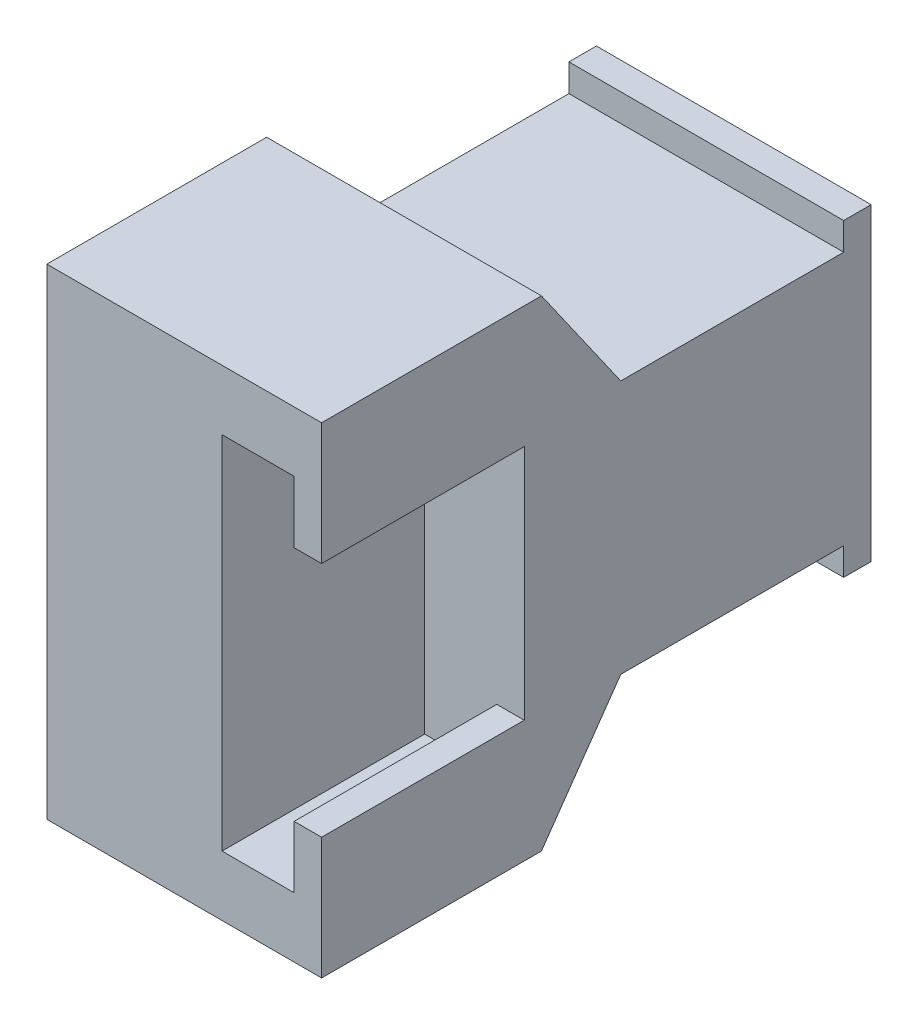
ISO-10303-21;
HEADER;
FILE_DESCRIPTION(('STEP AP214'),'2;1');
FILE_NAME('part.step','',(''),(''),'','','');
FILE_SCHEMA(('AUTOMOTIVE_DESIGN { 1 0 10303 214 1 1 1 1 }'));
ENDSEC;
DATA;
#1=APPLICATION_CONTEXT('core data for automotive mechanical design processes');
#2=APPLICATION_PROTOCOL_DEFINITION('international standard','automotive_design',2000,#1);
#3=PRODUCT_CONTEXT('',#1,'mechanical');
#4=PRODUCT('Part','Part','',(#3));
#5=PRODUCT_RELATED_PRODUCT_CATEGORY('part','',(#4));
#6=PRODUCT_DEFINITION_FORMATION('','',#4);
#7=PRODUCT_DEFINITION_CONTEXT('part definition',#1,'design');
#8=PRODUCT_DEFINITION('design','',#6,#7);
#9=PRODUCT_DEFINITION_SHAPE('','',#8);
#10=(LENGTH_UNIT() NAMED_UNIT(*) SI_UNIT(.MILLI.,.METRE.));
#11=(NAMED_UNIT(*) PLANE_ANGLE_UNIT() SI_UNIT($,.RADIAN.));
#12=(NAMED_UNIT(*) SI_UNIT($,.STERADIAN.) SOLID_ANGLE_UNIT());
#13=UNCERTAINTY_MEASURE_WITH_UNIT(LENGTH_MEASURE(1.E-05),#10,'distance_accuracy_value','');
#14=(GEOMETRIC_REPRESENTATION_CONTEXT(3) GLOBAL_UNCERTAINTY_ASSIGNED_CONTEXT((#13)) GLOBAL_UNIT_ASSIGNED_CONTEXT((#10,
#11,#12)) REPRESENTATION_CONTEXT('',''));
#15=CARTESIAN_POINT('',(0.,0.,0.));
#16=DIRECTION('',(0.,0.,1.));
#17=DIRECTION('',(1.,0.,0.));
#18=AXIS2_PLACEMENT_3D('',#15,#16,#17);
#19=CARTESIAN_POINT('',(8.00000000000001,13.125,25.25));
#20=DIRECTION('',(1.,0.,0.));
#21=DIRECTION('',(0.,1.,0.));
#22=AXIS2_PLACEMENT_3D('',#19,#20,#21);
#23=PLANE('',#22);
#24=DIRECTION('',(0.,0.,1.));
#25=VECTOR('',#24,1.);
#26=CARTESIAN_POINT('',(8.00000000000001,-8.625,25.25));
#27=LINE('',#26,#25);
#28=CARTESIAN_POINT('',(8.00000000000001,-8.625,25.25));
#29=VERTEX_POINT('',#28);
#30=CARTESIAN_POINT('',(8.00000000000001,-8.625,40.));
#31=VERTEX_POINT('',#30);
#32=EDGE_CURVE('E201',#29,#31,#27,.T.);
#33=ORIENTED_EDGE('',*,*,#32,.F.);
#34=DIRECTION('',(0.,1.,0.));
#35=VECTOR('',#34,1.);
#36=CARTESIAN_POINT('',(8.00000000000001,13.125,25.25));
#37=LINE('',#36,#35);
#38=CARTESIAN_POINT('',(8.00000000000001,-13.125,25.25));
#39=VERTEX_POINT('',#38);
#40=EDGE_CURVE('E207',#39,#29,#37,.T.);
#41=ORIENTED_EDGE('',*,*,#40,.F.);
#42=DIRECTION('',(0.,0.,1.));
#43=VECTOR('',#42,1.);
#44=CARTESIAN_POINT('',(8.00000000000001,-13.125,25.25));
#45=LINE('',#44,#43);
#46=CARTESIAN_POINT('',(8.00000000000001,-13.125,40.));
#47=VERTEX_POINT('',#46);
#48=EDGE_CURVE('E233',#39,#47,#45,.T.);
#49=ORIENTED_EDGE('',*,*,#48,.T.);
#50=DIRECTION('',(0.,1.,0.));
#51=VECTOR('',#50,1.);
#52=CARTESIAN_POINT('',(8.00000000000001,13.125,40.));
#53=LINE('',#52,#51);
#54=EDGE_CURVE('E216',#47,#31,#53,.T.);
#55=ORIENTED_EDGE('',*,*,#54,.T.);
#56=EDGE_LOOP('',(#33,#41,#49,#55));
#57=FACE_BOUND('',#56,.T.);
#58=ADVANCED_FACE('F41',(#57),#23,.F.);
#59=CARTESIAN_POINT('',(-10.,9.25,17.));
#60=DIRECTION('',(0.,-1.,0.));
#61=DIRECTION('',(0.,0.,-1.));
#62=AXIS2_PLACEMENT_3D('',#59,#60,#61);
#63=PLANE('',#62);
#64=DIRECTION('',(1.,0.,0.));
#65=VECTOR('',#64,1.);
#66=CARTESIAN_POINT('',(-10.,9.25,2.));
#67=LINE('',#66,#65);
#68=CARTESIAN_POINT('',(-10.,9.25,2.));
#69=VERTEX_POINT('',#68);
#70=CARTESIAN_POINT('',(10.,9.25,2.));
#71=VERTEX_POINT('',#70);
#72=EDGE_CURVE('E258',#69,#71,#67,.T.);
#73=ORIENTED_EDGE('',*,*,#72,.F.);
#74=DIRECTION('',(0.,0.,-1.));
#75=VECTOR('',#74,1.);
#76=CARTESIAN_POINT('',(-10.,9.25,17.));
#77=LINE('',#76,#75);
#78=CARTESIAN_POINT('',(-10.,9.25,18.225));
#79=VERTEX_POINT('',#78);
#80=EDGE_CURVE('E310',#79,#69,#77,.T.);
#81=ORIENTED_EDGE('',*,*,#80,.F.);
#82=DIRECTION('',(-1.,0.,0.));
#83=VECTOR('',#82,1.);
#84=CARTESIAN_POINT('',(-10.,9.25,18.225));
#85=LINE('',#84,#83);
#86=CARTESIAN_POINT('',(10.,9.25,18.225));
#87=VERTEX_POINT('',#86);
#88=EDGE_CURVE('E318',#79,#87,#85,.F.);
#89=ORIENTED_EDGE('',*,*,#88,.T.);
#90=DIRECTION('',(0.,0.,-1.));
#91=VECTOR('',#90,1.);
#92=CARTESIAN_POINT('',(10.,9.25,17.));
#93=LINE('',#92,#91);
#94=EDGE_CURVE('E309',#87,#71,#93,.T.);
#95=ORIENTED_EDGE('',*,*,#94,.T.);
#96=EDGE_LOOP('',(#73,#81,#89,#95));
#97=FACE_BOUND('',#96,.T.);
#98=ADVANCED_FACE('F357',(#97),#63,.F.);
#99=CARTESIAN_POINT('',(-10.,-9.25,17.));
#100=DIRECTION('',(0.,1.,0.));
#101=DIRECTION('',(0.,0.,1.));
#102=AXIS2_PLACEMENT_3D('',#99,#100,#101);
#103=PLANE('',#102);
#104=DIRECTION('',(-1.,0.,0.));
#105=VECTOR('',#104,1.);
#106=CARTESIAN_POINT('',(-10.,-9.25,2.));
#107=LINE('',#106,#105);
#108=CARTESIAN_POINT('',(10.,-9.25,2.00000000000001));
#109=VERTEX_POINT('',#108);
#110=CARTESIAN_POINT('',(-10.,-9.25,2.));
#111=VERTEX_POINT('',#110);
#112=EDGE_CURVE('E280',#109,#111,#107,.T.);
#113=ORIENTED_EDGE('',*,*,#112,.F.);
#114=DIRECTION('',(0.,0.,-1.));
#115=VECTOR('',#114,1.);
#116=CARTESIAN_POINT('',(10.,-9.25,17.));
#117=LINE('',#116,#115);
#118=CARTESIAN_POINT('',(10.,-9.25,18.225));
#119=VERTEX_POINT('',#118);
#120=EDGE_CURVE('E305',#119,#109,#117,.T.);
#121=ORIENTED_EDGE('',*,*,#120,.F.);
#122=DIRECTION('',(1.,0.,0.));
#123=VECTOR('',#122,1.);
#124=CARTESIAN_POINT('',(-10.,-9.25,18.225));
#125=LINE('',#124,#123);
#126=CARTESIAN_POINT('',(-10.,-9.25,18.225));
#127=VERTEX_POINT('',#126);
#128=EDGE_CURVE('E11',#119,#127,#125,.F.);
#129=ORIENTED_EDGE('',*,*,#128,.T.);
#130=DIRECTION('',(0.,0.,-1.));
#131=VECTOR('',#130,1.);
#132=CARTESIAN_POINT('',(-10.,-9.25,17.));
#133=LINE('',#132,#131);
#134=EDGE_CURVE('E304',#127,#111,#133,.T.);
#135=ORIENTED_EDGE('',*,*,#134,.T.);
#136=EDGE_LOOP('',(#113,#121,#129,#135));
#137=FACE_BOUND('',#136,.T.);
#138=ADVANCED_FACE('F378',(#137),#103,.F.);
#139=CARTESIAN_POINT('',(10.,9.25,17.));
#140=DIRECTION('',(-1.,0.,0.));
#141=DIRECTION('',(0.,0.,1.));
#142=AXIS2_PLACEMENT_3D('',#139,#140,#141);
#143=PLANE('',#142);
#144=DIRECTION('',(0.,1.,0.));
#145=VECTOR('',#144,1.);
#146=CARTESIAN_POINT('',(10.,8.625,25.25));
#147=LINE('',#146,#145);
#148=CARTESIAN_POINT('',(10.,-8.625,25.25));
#149=VERTEX_POINT('',#148);
#150=CARTESIAN_POINT('',(10.,8.625,25.25));
#151=VERTEX_POINT('',#150);
#152=EDGE_CURVE('E189',#149,#151,#147,.T.);
#153=ORIENTED_EDGE('',*,*,#152,.F.);
#154=DIRECTION('',(0.,0.,1.));
#155=VECTOR('',#154,1.);
#156=CARTESIAN_POINT('',(10.,-8.625,25.25));
#157=LINE('',#156,#155);
#158=CARTESIAN_POINT('',(10.,-8.625,40.));
#159=VERTEX_POINT('',#158);
#160=EDGE_CURVE('E341',#149,#159,#157,.T.);
#161=ORIENTED_EDGE('',*,*,#160,.T.);
#162=DIRECTION('',(0.,1.,0.));
#163=VECTOR('',#162,1.);
#164=CARTESIAN_POINT('',(10.,17.5,40.));
#165=LINE('',#164,#163);
#166=CARTESIAN_POINT('',(10.,-17.5,40.));
#167=VERTEX_POINT('',#166);
#168=EDGE_CURVE('E238',#167,#159,#165,.T.);
#169=ORIENTED_EDGE('',*,*,#168,.F.);
#170=DIRECTION('',(0.,0.,-1.));
#171=VECTOR('',#170,1.);
#172=CARTESIAN_POINT('',(10.,-17.5,40.));
#173=LINE('',#172,#171);
#174=CARTESIAN_POINT('',(10.,-17.5,24.0000000000001));
#175=VERTEX_POINT('',#174);
#176=EDGE_CURVE('E250',#167,#175,#173,.T.);
#177=ORIENTED_EDGE('',*,*,#176,.T.);
#178=DIRECTION('',(0.,-0.819231920519039,0.57346234436333));
#179=VECTOR('',#178,1.);
#180=CARTESIAN_POINT('',(10.,-17.5,24.0000000000001));
#181=LINE('',#180,#179);
#182=EDGE_CURVE('E327',#175,#119,#181,.F.);
#183=ORIENTED_EDGE('',*,*,#182,.T.);
#184=ORIENTED_EDGE('',*,*,#120,.T.);
#185=DIRECTION('',(0.,1.,0.));
#186=VECTOR('',#185,1.);
#187=CARTESIAN_POINT('',(10.,-11.25,2.00000000000001));
#188=LINE('',#187,#186);
#189=CARTESIAN_POINT('',(10.,-11.25,2.00000000000001));
#190=VERTEX_POINT('',#189);
#191=EDGE_CURVE('E294',#190,#109,#188,.T.);
#192=ORIENTED_EDGE('',*,*,#191,.F.);
#193=DIRECTION('',(0.,0.,1.));
#194=VECTOR('',#193,1.);
#195=CARTESIAN_POINT('',(10.,-11.25,2.00000000000001));
#196=LINE('',#195,#194);
#197=CARTESIAN_POINT('',(10.,-11.25,0.));
#198=VERTEX_POINT('',#197);
#199=EDGE_CURVE('E278',#198,#190,#196,.T.);
#200=ORIENTED_EDGE('',*,*,#199,.F.);
#201=DIRECTION('',(0.,1.,0.));
#202=VECTOR('',#201,1.);
#203=CARTESIAN_POINT('',(10.,9.25,0.));
#204=LINE('',#203,#202);
#205=CARTESIAN_POINT('',(10.,11.25,0.));
#206=VERTEX_POINT('',#205);
#207=EDGE_CURVE('E296',#198,#206,#204,.T.);
#208=ORIENTED_EDGE('',*,*,#207,.T.);
#209=DIRECTION('',(0.,0.,-1.));
#210=VECTOR('',#209,1.);
#211=CARTESIAN_POINT('',(10.,11.25,0.));
#212=LINE('',#211,#210);
#213=CARTESIAN_POINT('',(10.,11.25,2.));
#214=VERTEX_POINT('',#213);
#215=EDGE_CURVE('E257',#214,#206,#212,.T.);
#216=ORIENTED_EDGE('',*,*,#215,.F.);
#217=DIRECTION('',(0.,-1.,0.));
#218=VECTOR('',#217,1.);
#219=CARTESIAN_POINT('',(10.,11.25,2.));
#220=LINE('',#219,#218);
#221=EDGE_CURVE('E270',#214,#71,#220,.T.);
#222=ORIENTED_EDGE('',*,*,#221,.T.);
#223=ORIENTED_EDGE('',*,*,#94,.F.);
#224=DIRECTION('',(0.,-0.819231920519039,-0.57346234436333));
#225=VECTOR('',#224,1.);
#226=CARTESIAN_POINT('',(10.,17.5,24.0000000000001));
#227=LINE('',#226,#225);
#228=CARTESIAN_POINT('',(10.,17.5,24.0000000000001));
#229=VERTEX_POINT('',#228);
#230=EDGE_CURVE('E319',#87,#229,#227,.F.);
#231=ORIENTED_EDGE('',*,*,#230,.T.);
#232=DIRECTION('',(0.,0.,-1.));
#233=VECTOR('',#232,1.);
#234=CARTESIAN_POINT('',(10.,17.5,40.));
#235=LINE('',#234,#233);
#236=CARTESIAN_POINT('',(10.,17.5,40.));
#237=VERTEX_POINT('',#236);
#238=EDGE_CURVE('E259',#237,#229,#235,.T.);
#239=ORIENTED_EDGE('',*,*,#238,.F.);
#240=CARTESIAN_POINT('',(10.,8.625,40.));
#241=VERTEX_POINT('',#240);
#242=EDGE_CURVE('E196',#241,#237,#165,.T.);
#243=ORIENTED_EDGE('',*,*,#242,.F.);
#244=DIRECTION('',(0.,0.,1.));
#245=VECTOR('',#244,1.);
#246=CARTESIAN_POINT('',(10.,8.625,25.25));
#247=LINE('',#246,#245);
#248=EDGE_CURVE('E183',#151,#241,#247,.T.);
#249=ORIENTED_EDGE('',*,*,#248,.F.);
#250=EDGE_LOOP('',(#153,#161,#169,#177,#183,#184,#192,#200,#208,#216,#222,#223,#231,#239,#243,#249));
#251=FACE_BOUND('',#250,.T.);
#252=ADVANCED_FACE('F200',(#251),#143,.F.);
#253=CARTESIAN_POINT('',(-10.,9.25,17.));
#254=DIRECTION('',(1.,0.,0.));
#255=DIRECTION('',(0.,0.,-1.));
#256=AXIS2_PLACEMENT_3D('',#253,#254,#255);
#257=PLANE('',#256);
#258=ORIENTED_EDGE('',*,*,#134,.F.);
#259=DIRECTION('',(0.,0.819231920519039,-0.57346234436333));
#260=VECTOR('',#259,1.);
#261=CARTESIAN_POINT('',(-10.,-17.5,24.0000000000001));
#262=LINE('',#261,#260);
#263=CARTESIAN_POINT('',(-9.99999999999999,-17.5,24.0000000000001));
#264=VERTEX_POINT('',#263);
#265=EDGE_CURVE('E49',#127,#264,#262,.F.);
#266=ORIENTED_EDGE('',*,*,#265,.T.);
#267=DIRECTION('',(0.,0.,-1.));
#268=VECTOR('',#267,1.);
#269=CARTESIAN_POINT('',(-9.99999999999999,-17.5,40.));
#270=LINE('',#269,#268);
#271=CARTESIAN_POINT('',(-9.99999999999999,-17.5,40.));
#272=VERTEX_POINT('',#271);
#273=EDGE_CURVE('E249',#272,#264,#270,.T.);
#274=ORIENTED_EDGE('',*,*,#273,.F.);
#275=DIRECTION('',(0.,-1.,0.));
#276=VECTOR('',#275,1.);
#277=CARTESIAN_POINT('',(-10.,17.5,40.));
#278=LINE('',#277,#276);
#279=CARTESIAN_POINT('',(-10.,17.5,40.));
#280=VERTEX_POINT('',#279);
#281=EDGE_CURVE('E243',#280,#272,#278,.T.);
#282=ORIENTED_EDGE('',*,*,#281,.F.);
#283=DIRECTION('',(0.,0.,-1.));
#284=VECTOR('',#283,1.);
#285=CARTESIAN_POINT('',(-10.,17.5,40.));
#286=LINE('',#285,#284);
#287=CARTESIAN_POINT('',(-10.,17.5,24.0000000000001));
#288=VERTEX_POINT('',#287);
#289=EDGE_CURVE('E254',#280,#288,#286,.T.);
#290=ORIENTED_EDGE('',*,*,#289,.T.);
#291=DIRECTION('',(0.,0.819231920519039,0.57346234436333));
#292=VECTOR('',#291,1.);
#293=CARTESIAN_POINT('',(-10.,17.5,24.0000000000001));
#294=LINE('',#293,#292);
#295=EDGE_CURVE('E314',#288,#79,#294,.F.);
#296=ORIENTED_EDGE('',*,*,#295,.T.);
#297=ORIENTED_EDGE('',*,*,#80,.T.);
#298=DIRECTION('',(0.,-1.,0.));
#299=VECTOR('',#298,1.);
#300=CARTESIAN_POINT('',(-10.,11.25,2.));
#301=LINE('',#300,#299);
#302=CARTESIAN_POINT('',(-10.,11.25,2.));
#303=VERTEX_POINT('',#302);
#304=EDGE_CURVE('E273',#303,#69,#301,.T.);
#305=ORIENTED_EDGE('',*,*,#304,.F.);
#306=DIRECTION('',(0.,0.,1.));
#307=VECTOR('',#306,1.);
#308=CARTESIAN_POINT('',(-10.,11.25,0.));
#309=LINE('',#308,#307);
#310=CARTESIAN_POINT('',(-10.,11.25,0.));
#311=VERTEX_POINT('',#310);
#312=EDGE_CURVE('E266',#311,#303,#309,.T.);
#313=ORIENTED_EDGE('',*,*,#312,.F.);
#314=DIRECTION('',(0.,-1.,0.));
#315=VECTOR('',#314,1.);
#316=CARTESIAN_POINT('',(-10.,9.25,0.));
#317=LINE('',#316,#315);
#318=CARTESIAN_POINT('',(-10.,-11.25,0.));
#319=VERTEX_POINT('',#318);
#320=EDGE_CURVE('E297',#311,#319,#317,.T.);
#321=ORIENTED_EDGE('',*,*,#320,.T.);
#322=DIRECTION('',(0.,0.,-1.));
#323=VECTOR('',#322,1.);
#324=CARTESIAN_POINT('',(-10.,-11.25,2.));
#325=LINE('',#324,#323);
#326=CARTESIAN_POINT('',(-10.,-11.25,2.));
#327=VERTEX_POINT('',#326);
#328=EDGE_CURVE('E281',#327,#319,#325,.T.);
#329=ORIENTED_EDGE('',*,*,#328,.F.);
#330=DIRECTION('',(0.,1.,0.));
#331=VECTOR('',#330,1.);
#332=CARTESIAN_POINT('',(-10.,-11.25,2.));
#333=LINE('',#332,#331);
#334=EDGE_CURVE('E290',#327,#111,#333,.T.);
#335=ORIENTED_EDGE('',*,*,#334,.T.);
#336=EDGE_LOOP('',(#258,#266,#274,#282,#290,#296,#297,#305,#313,#321,#329,#335));
#337=FACE_BOUND('',#336,.T.);
#338=ADVANCED_FACE('F331',(#337),#257,.F.);
#339=CARTESIAN_POINT('',(0.,0.,0.));
#340=DIRECTION('',(0.,0.,1.));
#341=DIRECTION('',(1.,0.,0.));
#342=AXIS2_PLACEMENT_3D('',#339,#340,#341);
#343=PLANE('',#342);
#344=ORIENTED_EDGE('',*,*,#207,.F.);
#345=DIRECTION('',(1.,0.,0.));
#346=VECTOR('',#345,1.);
#347=CARTESIAN_POINT('',(-10.,-11.25,0.));
#348=LINE('',#347,#346);
#349=EDGE_CURVE('E287',#319,#198,#348,.T.);
#350=ORIENTED_EDGE('',*,*,#349,.F.);
#351=ORIENTED_EDGE('',*,*,#320,.F.);
#352=DIRECTION('',(-1.,0.,0.));
#353=VECTOR('',#352,1.);
#354=CARTESIAN_POINT('',(-10.,11.25,0.));
#355=LINE('',#354,#353);
#356=EDGE_CURVE('E264',#206,#311,#355,.T.);
#357=ORIENTED_EDGE('',*,*,#356,.F.);
#358=EDGE_LOOP('',(#344,#350,#351,#357));
#359=FACE_BOUND('',#358,.T.);
#360=ADVANCED_FACE('F374',(#359),#343,.F.);
#361=CARTESIAN_POINT('',(-10.,-11.25,2.));
#362=DIRECTION('',(0.,0.,-1.));
#363=DIRECTION('',(-1.,0.,0.));
#364=AXIS2_PLACEMENT_3D('',#361,#362,#363);
#365=PLANE('',#364);
#366=ORIENTED_EDGE('',*,*,#112,.T.);
#367=ORIENTED_EDGE('',*,*,#334,.F.);
#368=DIRECTION('',(-1.,0.,0.));
#369=VECTOR('',#368,1.);
#370=CARTESIAN_POINT('',(-10.,-11.25,2.));
#371=LINE('',#370,#369);
#372=EDGE_CURVE('E285',#190,#327,#371,.T.);
#373=ORIENTED_EDGE('',*,*,#372,.F.);
#374=ORIENTED_EDGE('',*,*,#191,.T.);
#375=EDGE_LOOP('',(#366,#367,#373,#374));
#376=FACE_BOUND('',#375,.T.);
#377=ADVANCED_FACE('F380',(#376),#365,.F.);
#378=CARTESIAN_POINT('',(0.,-11.25,0.));
#379=DIRECTION('',(0.,-1.,0.));
#380=DIRECTION('',(0.,0.,-1.));
#381=AXIS2_PLACEMENT_3D('',#378,#379,#380);
#382=PLANE('',#381);
#383=ORIENTED_EDGE('',*,*,#199,.T.);
#384=ORIENTED_EDGE('',*,*,#372,.T.);
#385=ORIENTED_EDGE('',*,*,#328,.T.);
#386=ORIENTED_EDGE('',*,*,#349,.T.);
#387=EDGE_LOOP('',(#383,#384,#385,#386));
#388=FACE_BOUND('',#387,.T.);
#389=ADVANCED_FACE('F375',(#388),#382,.T.);
#390=CARTESIAN_POINT('',(-10.,11.25,2.));
#391=DIRECTION('',(0.,0.,-1.));
#392=DIRECTION('',(-1.,0.,0.));
#393=AXIS2_PLACEMENT_3D('',#390,#391,#392);
#394=PLANE('',#393);
#395=ORIENTED_EDGE('',*,*,#72,.T.);
#396=ORIENTED_EDGE('',*,*,#221,.F.);
#397=DIRECTION('',(1.,0.,0.));
#398=VECTOR('',#397,1.);
#399=CARTESIAN_POINT('',(-10.,11.25,2.));
#400=LINE('',#399,#398);
#401=EDGE_CURVE('E269',#303,#214,#400,.T.);
#402=ORIENTED_EDGE('',*,*,#401,.F.);
#403=ORIENTED_EDGE('',*,*,#304,.T.);
#404=EDGE_LOOP('',(#395,#396,#402,#403));
#405=FACE_BOUND('',#404,.T.);
#406=ADVANCED_FACE('F365',(#405),#394,.F.);
#407=CARTESIAN_POINT('',(0.,11.25,0.));
#408=DIRECTION('',(0.,1.,0.));
#409=DIRECTION('',(0.,0.,1.));
#410=AXIS2_PLACEMENT_3D('',#407,#408,#409);
#411=PLANE('',#410);
#412=ORIENTED_EDGE('',*,*,#215,.T.);
#413=ORIENTED_EDGE('',*,*,#356,.T.);
#414=ORIENTED_EDGE('',*,*,#312,.T.);
#415=ORIENTED_EDGE('',*,*,#401,.T.);
#416=EDGE_LOOP('',(#412,#413,#414,#415));
#417=FACE_BOUND('',#416,.T.);
#418=ADVANCED_FACE('F366',(#417),#411,.T.);
#419=CARTESIAN_POINT('',(-10.,17.5,40.));
#420=DIRECTION('',(0.,-1.,0.));
#421=DIRECTION('',(0.,0.,-1.));
#422=AXIS2_PLACEMENT_3D('',#419,#420,#421);
#423=PLANE('',#422);
#424=ORIENTED_EDGE('',*,*,#238,.T.);
#425=DIRECTION('',(-1.,0.,0.));
#426=VECTOR('',#425,1.);
#427=CARTESIAN_POINT('',(-10.,17.5,24.0000000000001));
#428=LINE('',#427,#426);
#429=EDGE_CURVE('E315',#229,#288,#428,.T.);
#430=ORIENTED_EDGE('',*,*,#429,.T.);
#431=ORIENTED_EDGE('',*,*,#289,.F.);
#432=DIRECTION('',(-1.,0.,0.));
#433=VECTOR('',#432,1.);
#434=CARTESIAN_POINT('',(-10.,17.5,40.));
#435=LINE('',#434,#433);
#436=EDGE_CURVE('E241',#237,#280,#435,.T.);
#437=ORIENTED_EDGE('',*,*,#436,.F.);
#438=EDGE_LOOP('',(#424,#430,#431,#437));
#439=FACE_BOUND('',#438,.T.);
#440=ADVANCED_FACE('F351',(#439),#423,.F.);
#441=CARTESIAN_POINT('',(-9.99999999999999,-17.5,40.));
#442=DIRECTION('',(0.,1.,0.));
#443=DIRECTION('',(0.,0.,1.));
#444=AXIS2_PLACEMENT_3D('',#441,#442,#443);
#445=PLANE('',#444);
#446=ORIENTED_EDGE('',*,*,#273,.T.);
#447=DIRECTION('',(1.,0.,0.));
#448=VECTOR('',#447,1.);
#449=CARTESIAN_POINT('',(-9.99999999999999,-17.5,24.0000000000001));
#450=LINE('',#449,#448);
#451=EDGE_CURVE('E325',#264,#175,#450,.T.);
#452=ORIENTED_EDGE('',*,*,#451,.T.);
#453=ORIENTED_EDGE('',*,*,#176,.F.);
#454=DIRECTION('',(1.,0.,0.));
#455=VECTOR('',#454,1.);
#456=CARTESIAN_POINT('',(-9.99999999999999,-17.5,40.));
#457=LINE('',#456,#455);
#458=EDGE_CURVE('E244',#272,#167,#457,.T.);
#459=ORIENTED_EDGE('',*,*,#458,.F.);
#460=EDGE_LOOP('',(#446,#452,#453,#459));
#461=FACE_BOUND('',#460,.T.);
#462=ADVANCED_FACE('F336',(#461),#445,.F.);
#463=CARTESIAN_POINT('',(0.,0.,40.));
#464=DIRECTION('',(0.,0.,1.));
#465=DIRECTION('',(1.,0.,0.));
#466=AXIS2_PLACEMENT_3D('',#463,#464,#465);
#467=PLANE('',#466);
#468=DIRECTION('',(-1.,0.,0.));
#469=VECTOR('',#468,1.);
#470=CARTESIAN_POINT('',(8.00000000000001,8.625,40.));
#471=LINE('',#470,#469);
#472=CARTESIAN_POINT('',(8.00000000000001,8.625,40.));
#473=VERTEX_POINT('',#472);
#474=EDGE_CURVE('E430',#241,#473,#471,.T.);
#475=ORIENTED_EDGE('',*,*,#474,.F.);
#476=ORIENTED_EDGE('',*,*,#242,.T.);
#477=ORIENTED_EDGE('',*,*,#436,.T.);
#478=ORIENTED_EDGE('',*,*,#281,.T.);
#479=ORIENTED_EDGE('',*,*,#458,.T.);
#480=ORIENTED_EDGE('',*,*,#168,.T.);
#481=DIRECTION('',(1.,0.,0.));
#482=VECTOR('',#481,1.);
#483=CARTESIAN_POINT('',(8.00000000000001,-8.625,40.));
#484=LINE('',#483,#482);
#485=EDGE_CURVE('E193',#31,#159,#484,.T.);
#486=ORIENTED_EDGE('',*,*,#485,.F.);
#487=ORIENTED_EDGE('',*,*,#54,.F.);
#488=DIRECTION('',(1.,0.,0.));
#489=VECTOR('',#488,1.);
#490=CARTESIAN_POINT('',(2.75000000000001,-13.125,40.));
#491=LINE('',#490,#489);
#492=CARTESIAN_POINT('',(2.75000000000001,-13.125,40.));
#493=VERTEX_POINT('',#492);
#494=EDGE_CURVE('E226',#493,#47,#491,.T.);
#495=ORIENTED_EDGE('',*,*,#494,.F.);
#496=DIRECTION('',(0.,-1.,0.));
#497=VECTOR('',#496,1.);
#498=CARTESIAN_POINT('',(2.75,13.125,40.));
#499=LINE('',#498,#497);
#500=CARTESIAN_POINT('',(2.75,13.125,40.));
#501=VERTEX_POINT('',#500);
#502=EDGE_CURVE('E225',#501,#493,#499,.T.);
#503=ORIENTED_EDGE('',*,*,#502,.F.);
#504=DIRECTION('',(-1.,0.,0.));
#505=VECTOR('',#504,1.);
#506=CARTESIAN_POINT('',(2.75,13.125,40.));
#507=LINE('',#506,#505);
#508=CARTESIAN_POINT('',(8.00000000000001,13.125,40.));
#509=VERTEX_POINT('',#508);
#510=EDGE_CURVE('E222',#509,#501,#507,.T.);
#511=ORIENTED_EDGE('',*,*,#510,.F.);
#512=EDGE_CURVE('E62',#473,#509,#53,.T.);
#513=ORIENTED_EDGE('',*,*,#512,.F.);
#514=EDGE_LOOP('',(#475,#476,#477,#478,#479,#480,#486,#487,#495,#503,#511,#513));
#515=FACE_BOUND('',#514,.T.);
#516=ADVANCED_FACE('F342',(#515),#467,.T.);
#517=CARTESIAN_POINT('',(-10.,17.5,24.0000000000001));
#518=DIRECTION('',(0.,-0.57346234436333,0.819231920519039));
#519=DIRECTION('',(-1.,0.,0.));
#520=AXIS2_PLACEMENT_3D('',#517,#518,#519);
#521=PLANE('',#520);
#522=ORIENTED_EDGE('',*,*,#230,.F.);
#523=ORIENTED_EDGE('',*,*,#88,.F.);
#524=ORIENTED_EDGE('',*,*,#295,.F.);
#525=ORIENTED_EDGE('',*,*,#429,.F.);
#526=EDGE_LOOP('',(#522,#523,#524,#525));
#527=FACE_BOUND('',#526,.T.);
#528=ADVANCED_FACE('F355',(#527),#521,.F.);
#529=CARTESIAN_POINT('',(-9.99999999999999,-17.5,24.0000000000001));
#530=DIRECTION('',(0.,0.57346234436333,0.819231920519039));
#531=DIRECTION('',(1.,0.,0.));
#532=AXIS2_PLACEMENT_3D('',#529,#530,#531);
#533=PLANE('',#532);
#534=ORIENTED_EDGE('',*,*,#265,.F.);
#535=ORIENTED_EDGE('',*,*,#128,.F.);
#536=ORIENTED_EDGE('',*,*,#182,.F.);
#537=ORIENTED_EDGE('',*,*,#451,.F.);
#538=EDGE_LOOP('',(#534,#535,#536,#537));
#539=FACE_BOUND('',#538,.T.);
#540=ADVANCED_FACE('F42',(#539),#533,.F.);
#541=CARTESIAN_POINT('',(8.00000000000001,8.625,25.25));
#542=VERTEX_POINT('',#541);
#543=CARTESIAN_POINT('',(8.00000000000001,13.125,25.25));
#544=VERTEX_POINT('',#543);
#545=EDGE_CURVE('E209',#542,#544,#37,.T.);
#546=ORIENTED_EDGE('',*,*,#545,.F.);
#547=DIRECTION('',(0.,0.,1.));
#548=VECTOR('',#547,1.);
#549=CARTESIAN_POINT('',(8.00000000000001,8.625,25.25));
#550=LINE('',#549,#548);
#551=EDGE_CURVE('E187',#542,#473,#550,.T.);
#552=ORIENTED_EDGE('',*,*,#551,.T.);
#553=ORIENTED_EDGE('',*,*,#512,.T.);
#554=DIRECTION('',(0.,0.,1.));
#555=VECTOR('',#554,1.);
#556=CARTESIAN_POINT('',(8.00000000000001,13.125,25.25));
#557=LINE('',#556,#555);
#558=EDGE_CURVE('E219',#544,#509,#557,.T.);
#559=ORIENTED_EDGE('',*,*,#558,.F.);
#560=EDGE_LOOP('',(#546,#552,#553,#559));
#561=FACE_BOUND('',#560,.T.);
#562=ADVANCED_FACE('F393',(#561),#23,.F.);
#563=CARTESIAN_POINT('',(2.75000000000001,-13.125,25.25));
#564=DIRECTION('',(0.,-1.,0.));
#565=DIRECTION('',(0.,0.,-1.));
#566=AXIS2_PLACEMENT_3D('',#563,#564,#565);
#567=PLANE('',#566);
#568=ORIENTED_EDGE('',*,*,#494,.T.);
#569=ORIENTED_EDGE('',*,*,#48,.F.);
#570=DIRECTION('',(1.,0.,0.));
#571=VECTOR('',#570,1.);
#572=CARTESIAN_POINT('',(2.75000000000001,-13.125,25.25));
#573=LINE('',#572,#571);
#574=CARTESIAN_POINT('',(2.75000000000001,-13.125,25.25));
#575=VERTEX_POINT('',#574);
#576=EDGE_CURVE('E212',#575,#39,#573,.T.);
#577=ORIENTED_EDGE('',*,*,#576,.F.);
#578=DIRECTION('',(0.,0.,1.));
#579=VECTOR('',#578,1.);
#580=CARTESIAN_POINT('',(2.75000000000001,-13.125,25.25));
#581=LINE('',#580,#579);
#582=EDGE_CURVE('E231',#575,#493,#581,.T.);
#583=ORIENTED_EDGE('',*,*,#582,.T.);
#584=EDGE_LOOP('',(#568,#569,#577,#583));
#585=FACE_BOUND('',#584,.T.);
#586=ADVANCED_FACE('F401',(#585),#567,.F.);
#587=CARTESIAN_POINT('',(2.75,13.125,25.25));
#588=DIRECTION('',(-1.,0.,0.));
#589=DIRECTION('',(0.,-1.,0.));
#590=AXIS2_PLACEMENT_3D('',#587,#588,#589);
#591=PLANE('',#590);
#592=ORIENTED_EDGE('',*,*,#502,.T.);
#593=ORIENTED_EDGE('',*,*,#582,.F.);
#594=DIRECTION('',(0.,-1.,0.));
#595=VECTOR('',#594,1.);
#596=CARTESIAN_POINT('',(2.75,13.125,25.25));
#597=LINE('',#596,#595);
#598=CARTESIAN_POINT('',(2.75,13.125,25.25));
#599=VERTEX_POINT('',#598);
#600=EDGE_CURVE('E211',#599,#575,#597,.T.);
#601=ORIENTED_EDGE('',*,*,#600,.F.);
#602=DIRECTION('',(0.,0.,1.));
#603=VECTOR('',#602,1.);
#604=CARTESIAN_POINT('',(2.75,13.125,25.25));
#605=LINE('',#604,#603);
#606=EDGE_CURVE('E232',#599,#501,#605,.T.);
#607=ORIENTED_EDGE('',*,*,#606,.T.);
#608=EDGE_LOOP('',(#592,#593,#601,#607));
#609=FACE_BOUND('',#608,.T.);
#610=ADVANCED_FACE('F408',(#609),#591,.F.);
#611=CARTESIAN_POINT('',(2.75,13.125,25.25));
#612=DIRECTION('',(0.,1.,0.));
#613=DIRECTION('',(0.,0.,1.));
#614=AXIS2_PLACEMENT_3D('',#611,#612,#613);
#615=PLANE('',#614);
#616=ORIENTED_EDGE('',*,*,#510,.T.);
#617=ORIENTED_EDGE('',*,*,#606,.F.);
#618=DIRECTION('',(-1.,0.,0.));
#619=VECTOR('',#618,1.);
#620=CARTESIAN_POINT('',(2.75,13.125,25.25));
#621=LINE('',#620,#619);
#622=EDGE_CURVE('E206',#544,#599,#621,.T.);
#623=ORIENTED_EDGE('',*,*,#622,.F.);
#624=ORIENTED_EDGE('',*,*,#558,.T.);
#625=EDGE_LOOP('',(#616,#617,#623,#624));
#626=FACE_BOUND('',#625,.T.);
#627=ADVANCED_FACE('F417',(#626),#615,.F.);
#628=CARTESIAN_POINT('',(0.,0.,25.25));
#629=DIRECTION('',(0.,0.,1.));
#630=DIRECTION('',(1.,0.,0.));
#631=AXIS2_PLACEMENT_3D('',#628,#629,#630);
#632=PLANE('',#631);
#633=ORIENTED_EDGE('',*,*,#40,.T.);
#634=DIRECTION('',(1.,0.,0.));
#635=VECTOR('',#634,1.);
#636=CARTESIAN_POINT('',(8.00000000000001,-8.625,25.25));
#637=LINE('',#636,#635);
#638=EDGE_CURVE('E60',#29,#149,#637,.T.);
#639=ORIENTED_EDGE('',*,*,#638,.T.);
#640=ORIENTED_EDGE('',*,*,#152,.T.);
#641=DIRECTION('',(-1.,0.,0.));
#642=VECTOR('',#641,1.);
#643=CARTESIAN_POINT('',(8.00000000000001,8.625,25.25));
#644=LINE('',#643,#642);
#645=EDGE_CURVE('E181',#151,#542,#644,.T.);
#646=ORIENTED_EDGE('',*,*,#645,.T.);
#647=ORIENTED_EDGE('',*,*,#545,.T.);
#648=ORIENTED_EDGE('',*,*,#622,.T.);
#649=ORIENTED_EDGE('',*,*,#600,.T.);
#650=ORIENTED_EDGE('',*,*,#576,.T.);
#651=EDGE_LOOP('',(#633,#639,#640,#646,#647,#648,#649,#650));
#652=FACE_BOUND('',#651,.T.);
#653=ADVANCED_FACE('F194',(#652),#632,.T.);
#654=CARTESIAN_POINT('',(8.00000000000001,-8.625,25.25));
#655=DIRECTION('',(0.,-1.,0.));
#656=DIRECTION('',(0.,0.,-1.));
#657=AXIS2_PLACEMENT_3D('',#654,#655,#656);
#658=PLANE('',#657);
#659=ORIENTED_EDGE('',*,*,#485,.T.);
#660=ORIENTED_EDGE('',*,*,#160,.F.);
#661=ORIENTED_EDGE('',*,*,#638,.F.);
#662=ORIENTED_EDGE('',*,*,#32,.T.);
#663=EDGE_LOOP('',(#659,#660,#661,#662));
#664=FACE_BOUND('',#663,.T.);
#665=ADVANCED_FACE('F426',(#664),#658,.F.);
#666=CARTESIAN_POINT('',(8.00000000000001,8.625,25.25));
#667=DIRECTION('',(0.,1.,0.));
#668=DIRECTION('',(0.,0.,1.));
#669=AXIS2_PLACEMENT_3D('',#666,#667,#668);
#670=PLANE('',#669);
#671=ORIENTED_EDGE('',*,*,#474,.T.);
#672=ORIENTED_EDGE('',*,*,#551,.F.);
#673=ORIENTED_EDGE('',*,*,#645,.F.);
#674=ORIENTED_EDGE('',*,*,#248,.T.);
#675=EDGE_LOOP('',(#671,#672,#673,#674));
#676=FACE_BOUND('',#675,.T.);
#677=ADVANCED_FACE('F185',(#676),#670,.F.);
#678=CLOSED_SHELL('',(#58,#98,#138,#252,#338,#360,#377,#389,#406,#418,#440,#462,#516,#528,#540,
#562,#586,#610,#627,#653,#665,#677));
#679=MANIFOLD_SOLID_BREP('B2',#678);
#680=ADVANCED_BREP_SHAPE_REPRESENTATION('',(#18,#679),#14);
#681=SHAPE_DEFINITION_REPRESENTATION(#9,#680);
ENDSEC;
END-ISO-10303-21;
